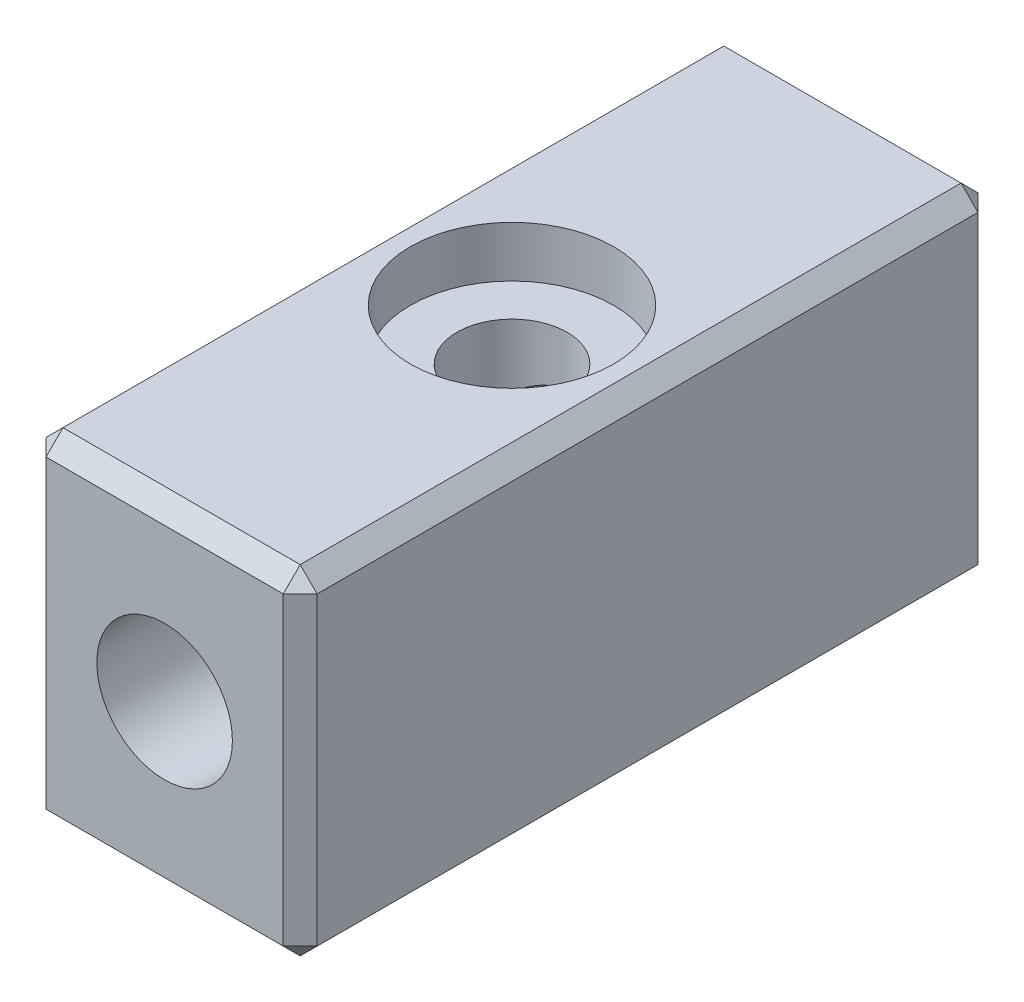
ISO-10303-21;
HEADER;
FILE_DESCRIPTION(('STEP AP214'),'2;1');
FILE_NAME('part.step','',(''),(''),'','','');
FILE_SCHEMA(('AUTOMOTIVE_DESIGN { 1 0 10303 214 1 1 1 1 }'));
ENDSEC;
DATA;
#1=APPLICATION_CONTEXT('core data for automotive mechanical design processes');
#2=APPLICATION_PROTOCOL_DEFINITION('international standard','automotive_design',2000,#1);
#3=PRODUCT_CONTEXT('',#1,'mechanical');
#4=PRODUCT('Part','Part','',(#3));
#5=PRODUCT_RELATED_PRODUCT_CATEGORY('part','',(#4));
#6=PRODUCT_DEFINITION_FORMATION('','',#4);
#7=PRODUCT_DEFINITION_CONTEXT('part definition',#1,'design');
#8=PRODUCT_DEFINITION('design','',#6,#7);
#9=PRODUCT_DEFINITION_SHAPE('','',#8);
#10=(LENGTH_UNIT() NAMED_UNIT(*) SI_UNIT(.MILLI.,.METRE.));
#11=(NAMED_UNIT(*) PLANE_ANGLE_UNIT() SI_UNIT($,.RADIAN.));
#12=(NAMED_UNIT(*) SI_UNIT($,.STERADIAN.) SOLID_ANGLE_UNIT());
#13=UNCERTAINTY_MEASURE_WITH_UNIT(LENGTH_MEASURE(1.E-05),#10,'distance_accuracy_value','');
#14=(GEOMETRIC_REPRESENTATION_CONTEXT(3) GLOBAL_UNCERTAINTY_ASSIGNED_CONTEXT((#13)) GLOBAL_UNIT_ASSIGNED_CONTEXT((#10,
#11,#12)) REPRESENTATION_CONTEXT('',''));
#15=CARTESIAN_POINT('',(0.,0.,0.));
#16=DIRECTION('',(0.,0.,1.));
#17=DIRECTION('',(1.,0.,0.));
#18=AXIS2_PLACEMENT_3D('',#15,#16,#17);
#19=CARTESIAN_POINT('',(0.,-7.,10.25));
#20=DIRECTION('',(0.,1.,0.));
#21=DIRECTION('',(0.,0.,1.));
#22=AXIS2_PLACEMENT_3D('',#19,#20,#21);
#23=CYLINDRICAL_SURFACE('',#22,1.625);
#24=CARTESIAN_POINT('',(0.,2.,11.875));
#25=CARTESIAN_POINT('',(-0.077687357955839,1.99999354879527,11.8749933728701));
#26=CARTESIAN_POINT('',(-0.155462967100208,1.9954284564811,11.8693836728164));
#27=CARTESIAN_POINT('',(-0.308487256323804,1.97757422208696,11.8473305319977));
#28=CARTESIAN_POINT('',(-0.383731179508215,1.96426952673167,11.8308677766017));
#29=CARTESIAN_POINT('',(-0.529074999974396,1.93018615668385,11.7883124160369));
#30=CARTESIAN_POINT('',(-0.599203974577691,1.90945447135066,11.7622803280343));
#31=CARTESIAN_POINT('',(-0.733522504384539,1.86199619588915,11.7018958027853));
#32=CARTESIAN_POINT('',(-0.797711368349583,1.83526890930099,11.667542398883));
#33=CARTESIAN_POINT('',(-0.941206531859363,1.76705472448252,11.57823941827));
#34=CARTESIAN_POINT('',(-1.0177698216182,1.72369928857352,11.5203101286191));
#35=CARTESIAN_POINT('',(-1.15841606691424,1.63252106893399,11.3935488484919));
#36=CARTESIAN_POINT('',(-1.22246224122534,1.58468571266492,11.3246857728611));
#37=CARTESIAN_POINT('',(-1.33872677424837,1.487823357685,11.1760175852269));
#38=CARTESIAN_POINT('',(-1.39072878178809,1.43878982761696,11.096048349981));
#39=CARTESIAN_POINT('',(-1.48083670468378,1.34583078460387,10.9259936395723));
#40=CARTESIAN_POINT('',(-1.51898725678864,1.30188918014082,10.8359419054729));
#41=CARTESIAN_POINT('',(-1.56620619398635,1.2440840418201,10.6867999699758));
#42=CARTESIAN_POINT('',(-1.58070420645942,1.22545550979627,10.6313054054931));
#43=CARTESIAN_POINT('',(-1.60390143116161,1.19493432086563,10.5173755541024));
#44=CARTESIAN_POINT('',(-1.61261510407165,1.18302487771775,10.45894799636));
#45=CARTESIAN_POINT('',(-1.62363276959609,1.16786855634705,10.3397153591291));
#46=CARTESIAN_POINT('',(-1.62587234290574,1.16470875271523,10.2788924483809));
#47=CARTESIAN_POINT('',(-1.62350766752796,1.16799987542873,10.1576287760698));
#48=CARTESIAN_POINT('',(-1.61889923037064,1.17445668361772,10.0971882711105));
#49=CARTESIAN_POINT('',(-1.6022761427835,1.19704696091321,9.97084588891335));
#50=CARTESIAN_POINT('',(-1.58936004790627,1.21435055427699,9.90528324485805));
#51=CARTESIAN_POINT('',(-1.55644163444395,1.25626308459862,9.77836394661769));
#52=CARTESIAN_POINT('',(-1.53641744395236,1.28089453135788,9.71702097997819));
#53=CARTESIAN_POINT('',(-1.47790201883828,1.34859403082441,9.56744588145881));
#54=CARTESIAN_POINT('',(-1.43524553441984,1.39452152288037,9.4821588315727));
#55=CARTESIAN_POINT('',(-1.33679489037521,1.4891899763325,9.3212882259169));
#56=CARTESIAN_POINT('',(-1.28097987831492,1.53793530967644,9.2457203690735));
#57=CARTESIAN_POINT('',(-1.15433872401482,1.63526989472892,9.1021333991519));
#58=CARTESIAN_POINT('',(-1.08305927003828,1.6837951535552,9.0344667952232));
#59=CARTESIAN_POINT('',(-0.927015757799725,1.7744700962118,8.91169323062353));
#60=CARTESIAN_POINT('',(-0.842286790015232,1.81663582895334,8.85655447011996));
#61=CARTESIAN_POINT('',(-0.685671013718499,1.88013018129862,8.77488262185814));
#62=CARTESIAN_POINT('',(-0.616738294216002,1.90399458902128,8.74465708978518));
#63=CARTESIAN_POINT('',(-0.473455645854618,1.94457361170736,8.69364776001418));
#64=CARTESIAN_POINT('',(-0.399109730639077,1.96129346211453,8.67285704790112));
#65=CARTESIAN_POINT('',(-0.246344739170605,1.98628664100974,8.64188178889347));
#66=CARTESIAN_POINT('',(-0.167903966792824,1.99450886882469,8.63176140101525));
#67=CARTESIAN_POINT('',(-0.00996672129135603,2.00153442722647,8.62310963033247));
#68=CARTESIAN_POINT('',(0.0695294082023801,2.00034075206231,8.62457456340624));
#69=CARTESIAN_POINT('',(0.219312970588321,1.98922346562989,8.63827805181183));
#70=CARTESIAN_POINT('',(0.289762052351858,1.9801334119513,8.64948798566098));
#71=CARTESIAN_POINT('',(0.427407686511049,1.95504988327428,8.68062754216478));
#72=CARTESIAN_POINT('',(0.494603559045785,1.93905497215433,8.70055897879158));
#73=CARTESIAN_POINT('',(0.627404269795816,1.9003601464828,8.74925923155521));
#74=CARTESIAN_POINT('',(0.692793217115817,1.87738529928881,8.77839285756732));
#75=CARTESIAN_POINT('',(0.817667719219735,1.82646509793591,8.84393312275018));
#76=CARTESIAN_POINT('',(0.877151786444768,1.79851849621727,8.88034158767549));
#77=CARTESIAN_POINT('',(1.01513524710928,1.72569252714969,8.97717697242691));
#78=CARTESIAN_POINT('',(1.09018367867275,1.67884365069025,9.04104900348188));
#79=CARTESIAN_POINT('',(1.22695555521745,1.58165720431014,9.18005516906171));
#80=CARTESIAN_POINT('',(1.28862015949084,1.53130546487771,9.25523666895536));
#81=CARTESIAN_POINT('',(1.37110195941884,1.45653421078326,9.37642546758947));
#82=CARTESIAN_POINT('',(1.39709959372071,1.43153212038635,9.41861101475694));
#83=CARTESIAN_POINT('',(1.44539231909061,1.38275992857254,9.5057177834228));
#84=CARTESIAN_POINT('',(1.46768551263704,1.35899046280348,9.55064039092076));
#85=CARTESIAN_POINT('',(1.52847949956992,1.2912633848622,9.6892130230092));
#86=CARTESIAN_POINT('',(1.56133620393295,1.25046214728857,9.78730441772));
#87=CARTESIAN_POINT('',(1.5968634847318,1.20434405557262,9.94399070919101));
#88=CARTESIAN_POINT('',(1.60644866246003,1.19140720613955,9.99877200022116));
#89=CARTESIAN_POINT('',(1.61994444914748,1.17299281931033,10.1102196235699));
#90=CARTESIAN_POINT('',(1.62386770772838,1.16749865547,10.1668814635633));
#91=CARTESIAN_POINT('',(1.62570963409608,1.16493507804418,10.2807054820751));
#92=CARTESIAN_POINT('',(1.62360681581816,1.16789581038235,10.3378687246475));
#93=CARTESIAN_POINT('',(1.61355345618824,1.18174104439322,10.4507372657298));
#94=CARTESIAN_POINT('',(1.60559226735473,1.19263997322404,10.5064397181272));
#95=CARTESIAN_POINT('',(1.58067789108497,1.22556487771296,10.6343148124194));
#96=CARTESIAN_POINT('',(1.56154555079501,1.25015755317511,10.7053805675171));
#97=CARTESIAN_POINT('',(1.51506288734557,1.30610544821361,10.8419878922432));
#98=CARTESIAN_POINT('',(1.48768553768955,1.33748281058379,10.9075103725864));
#99=CARTESIAN_POINT('',(1.41138626498154,1.41856466764915,11.0618134619428));
#100=CARTESIAN_POINT('',(1.35833177750582,1.47010478743265,11.147585713693));
#101=CARTESIAN_POINT('',(1.23751391200667,1.57318046622137,11.3079411129351));
#102=CARTESIAN_POINT('',(1.16975523582132,1.62471602142843,11.3825278242729));
#103=CARTESIAN_POINT('',(1.03231155414268,1.71461419442066,11.5078065282038));
#104=CARTESIAN_POINT('',(0.96487051375943,1.75373399309412,11.5604073167188));
#105=CARTESIAN_POINT('',(0.82024249010633,1.82584302570047,11.6554482830428));
#106=CARTESIAN_POINT('',(0.743069863040515,1.85884111680731,11.6979031664821));
#107=CARTESIAN_POINT('',(0.594860695751205,1.91079837319564,11.7639712673024));
#108=CARTESIAN_POINT('',(0.525238639571074,1.93121723151876,11.7896034609691));
#109=CARTESIAN_POINT('',(0.381555524372051,1.96464268363454,11.8313298075183));
#110=CARTESIAN_POINT('',(0.307504404800825,1.97766523340066,11.8474444954294));
#111=CARTESIAN_POINT('',(0.193986200590974,1.9909456812899,11.8638458679102));
#112=CARTESIAN_POINT('',(0.155396271357845,1.99433153032105,11.8680191571931));
#113=CARTESIAN_POINT('',(0.0778783362899849,1.99886054593715,11.8735981795442));
#114=CARTESIAN_POINT('',(0.0389502601635923,2.00000323445293,11.8750033226569));
#115=CARTESIAN_POINT('',(0.,2.,11.875));
#116=B_SPLINE_CURVE_WITH_KNOTS('',3,(#24,#25,#26,#27,#28,#29,#30,#31,#32,#33,#34,#35,#36,#37,
#38,#39,#40,#41,#42,#43,#44,#45,#46,#47,#48,#49,#50,#51,#52,#53,#54,#55,#56,#57,#58,#59,#60,#61,
#62,#63,#64,#65,#66,#67,#68,#69,#70,#71,#72,#73,#74,#75,#76,#77,#78,#79,#80,#81,#82,#83,#84,#85,
#86,#87,#88,#89,#90,#91,#92,#93,#94,#95,#96,#97,#98,#99,#100,#101,#102,#103,#104,#105,#106,#107,
#108,#109,#110,#111,#112,#113,#114,#115),.UNSPECIFIED.,.T.,.F.,(4,2,2,2,2,2,2,2,2,2,2,2,2,2,2,2,
2,2,2,2,2,2,2,2,2,2,2,2,2,2,2,2,2,2,2,2,2,2,2,2,2,2,2,2,2,4),(0.,0.232893690201569,
0.466202972393725,0.698061484041515,0.929946942750643,1.24430606287864,1.55957547108331,
1.88013164979569,2.19964546009525,2.38000999643275,2.55992191129705,2.74161794545689,
2.92342515667749,3.12935204702559,3.33591815537832,3.65177497720494,3.96813574520239,
4.29546377541527,4.62195141743018,4.85790440701917,5.09368419540844,5.33087374414643,
5.56798786985422,5.78274981565106,5.99755645070724,6.22225846581893,6.44701694502352,
6.77267104435955,7.09972908365389,7.26604462385623,7.43244509481405,7.76262481512771,
7.93328728313584,8.10356787079954,8.27445635096059,8.44565618732137,8.6771382083016,
8.90938742432821,9.24747595283561,9.58545653242122,9.86654805507715,10.1472296542537,
10.3771482894416,10.6065690211765,10.7233105012267,10.8400768588748),.UNSPECIFIED.);
#117=CARTESIAN_POINT('',(0.,2.,11.875));
#118=VERTEX_POINT('',#117);
#119=EDGE_CURVE('E276',#118,#118,#116,.T.);
#120=ORIENTED_EDGE('',*,*,#119,.T.);
#121=EDGE_LOOP('',(#120));
#122=FACE_BOUND('',#121,.T.);
#123=CARTESIAN_POINT('',(0.,3.5,10.25));
#124=DIRECTION('',(0.,1.,0.));
#125=DIRECTION('',(0.,0.,1.));
#126=AXIS2_PLACEMENT_3D('',#123,#124,#125);
#127=CIRCLE('',#126,1.625);
#128=CARTESIAN_POINT('',(0.,3.5,11.875));
#129=VERTEX_POINT('',#128);
#130=EDGE_CURVE('E57',#129,#129,#127,.F.);
#131=ORIENTED_EDGE('',*,*,#130,.F.);
#132=EDGE_LOOP('',(#131));
#133=FACE_BOUND('',#132,.T.);
#134=ADVANCED_FACE('F53',(#122,#133),#23,.F.);
#135=CARTESIAN_POINT('',(4.,0.,20.5));
#136=DIRECTION('',(1.,0.,0.));
#137=DIRECTION('',(0.,1.,0.));
#138=AXIS2_PLACEMENT_3D('',#135,#136,#137);
#139=PLANE('',#138);
#140=DIRECTION('',(0.,-1.,0.));
#141=VECTOR('',#140,1.);
#142=CARTESIAN_POINT('',(4.,0.,20.));
#143=LINE('',#142,#141);
#144=CARTESIAN_POINT('',(4.,4.49999999999999,20.));
#145=VERTEX_POINT('',#144);
#146=CARTESIAN_POINT('',(4.,-4.5,20.));
#147=VERTEX_POINT('',#146);
#148=EDGE_CURVE('E62',#145,#147,#143,.T.);
#149=ORIENTED_EDGE('',*,*,#148,.T.);
#150=DIRECTION('',(0.,0.,-1.));
#151=VECTOR('',#150,1.);
#152=CARTESIAN_POINT('',(4.,-4.5,0.));
#153=LINE('',#152,#151);
#154=CARTESIAN_POINT('',(4.,-4.5,0.500000000000007));
#155=VERTEX_POINT('',#154);
#156=EDGE_CURVE('E12',#147,#155,#153,.T.);
#157=ORIENTED_EDGE('',*,*,#156,.T.);
#158=DIRECTION('',(0.,1.,0.));
#159=VECTOR('',#158,1.);
#160=CARTESIAN_POINT('',(4.,5.,0.500000000000007));
#161=LINE('',#160,#159);
#162=CARTESIAN_POINT('',(4.,4.49999999999999,0.500000000000007));
#163=VERTEX_POINT('',#162);
#164=EDGE_CURVE('E76',#155,#163,#161,.T.);
#165=ORIENTED_EDGE('',*,*,#164,.T.);
#166=DIRECTION('',(0.,0.,1.));
#167=VECTOR('',#166,1.);
#168=CARTESIAN_POINT('',(4.,4.49999999999999,20.5));
#169=LINE('',#168,#167);
#170=EDGE_CURVE('E218',#163,#145,#169,.T.);
#171=ORIENTED_EDGE('',*,*,#170,.T.);
#172=EDGE_LOOP('',(#149,#157,#165,#171));
#173=FACE_BOUND('',#172,.T.);
#174=ADVANCED_FACE('F305',(#173),#139,.T.);
#175=CARTESIAN_POINT('',(0.,5.,20.5));
#176=DIRECTION('',(0.,1.,0.));
#177=DIRECTION('',(0.,0.,1.));
#178=AXIS2_PLACEMENT_3D('',#175,#176,#177);
#179=PLANE('',#178);
#180=CARTESIAN_POINT('',(0.,5.,10.25));
#181=DIRECTION('',(0.,1.,0.));
#182=DIRECTION('',(0.,0.,1.));
#183=AXIS2_PLACEMENT_3D('',#180,#181,#182);
#184=CIRCLE('',#183,3.);
#185=CARTESIAN_POINT('',(0.,5.,13.25));
#186=VERTEX_POINT('',#185);
#187=EDGE_CURVE('E326',#186,#186,#184,.T.);
#188=ORIENTED_EDGE('',*,*,#187,.F.);
#189=EDGE_LOOP('',(#188));
#190=FACE_BOUND('',#189,.T.);
#191=DIRECTION('',(-1.,0.,0.));
#192=VECTOR('',#191,1.);
#193=CARTESIAN_POINT('',(-4.,5.,0.5));
#194=LINE('',#193,#192);
#195=CARTESIAN_POINT('',(3.5,5.,0.5));
#196=VERTEX_POINT('',#195);
#197=CARTESIAN_POINT('',(-3.5,5.,0.5));
#198=VERTEX_POINT('',#197);
#199=EDGE_CURVE('E188',#196,#198,#194,.T.);
#200=ORIENTED_EDGE('',*,*,#199,.T.);
#201=DIRECTION('',(0.,0.,1.));
#202=VECTOR('',#201,1.);
#203=CARTESIAN_POINT('',(-3.5,5.,20.5));
#204=LINE('',#203,#202);
#205=CARTESIAN_POINT('',(-3.5,5.,20.));
#206=VERTEX_POINT('',#205);
#207=EDGE_CURVE('E151',#198,#206,#204,.T.);
#208=ORIENTED_EDGE('',*,*,#207,.T.);
#209=DIRECTION('',(1.,0.,0.));
#210=VECTOR('',#209,1.);
#211=CARTESIAN_POINT('',(0.,5.,20.));
#212=LINE('',#211,#210);
#213=CARTESIAN_POINT('',(3.5,5.,20.));
#214=VERTEX_POINT('',#213);
#215=EDGE_CURVE('E180',#206,#214,#212,.T.);
#216=ORIENTED_EDGE('',*,*,#215,.T.);
#217=DIRECTION('',(0.,0.,-1.));
#218=VECTOR('',#217,1.);
#219=CARTESIAN_POINT('',(3.5,5.,20.5));
#220=LINE('',#219,#218);
#221=EDGE_CURVE('E182',#214,#196,#220,.T.);
#222=ORIENTED_EDGE('',*,*,#221,.T.);
#223=EDGE_LOOP('',(#200,#208,#216,#222));
#224=FACE_BOUND('',#223,.T.);
#225=ADVANCED_FACE('F366',(#190,#224),#179,.T.);
#226=CARTESIAN_POINT('',(-4.,0.,20.5));
#227=DIRECTION('',(1.,0.,0.));
#228=DIRECTION('',(0.,0.,-1.));
#229=AXIS2_PLACEMENT_3D('',#226,#227,#228);
#230=PLANE('',#229);
#231=DIRECTION('',(0.,1.,0.));
#232=VECTOR('',#231,1.);
#233=CARTESIAN_POINT('',(-4.,5.,20.));
#234=LINE('',#233,#232);
#235=CARTESIAN_POINT('',(-4.,-4.49999999999999,20.));
#236=VERTEX_POINT('',#235);
#237=CARTESIAN_POINT('',(-4.,4.49999999999999,20.));
#238=VERTEX_POINT('',#237);
#239=EDGE_CURVE('E178',#236,#238,#234,.T.);
#240=ORIENTED_EDGE('',*,*,#239,.T.);
#241=DIRECTION('',(0.,0.,-1.));
#242=VECTOR('',#241,1.);
#243=CARTESIAN_POINT('',(-4.,4.49999999999999,0.));
#244=LINE('',#243,#242);
#245=CARTESIAN_POINT('',(-4.,4.49999999999999,0.5));
#246=VERTEX_POINT('',#245);
#247=EDGE_CURVE('E149',#238,#246,#244,.T.);
#248=ORIENTED_EDGE('',*,*,#247,.T.);
#249=DIRECTION('',(0.,-1.,0.));
#250=VECTOR('',#249,1.);
#251=CARTESIAN_POINT('',(-4.,0.,0.5));
#252=LINE('',#251,#250);
#253=CARTESIAN_POINT('',(-4.,-4.49999999999999,0.5));
#254=VERTEX_POINT('',#253);
#255=EDGE_CURVE('E167',#246,#254,#252,.T.);
#256=ORIENTED_EDGE('',*,*,#255,.T.);
#257=DIRECTION('',(0.,0.,1.));
#258=VECTOR('',#257,1.);
#259=CARTESIAN_POINT('',(-4.,-4.49999999999999,20.5));
#260=LINE('',#259,#258);
#261=EDGE_CURVE('E173',#254,#236,#260,.T.);
#262=ORIENTED_EDGE('',*,*,#261,.T.);
#263=EDGE_LOOP('',(#240,#248,#256,#262));
#264=FACE_BOUND('',#263,.T.);
#265=ADVANCED_FACE('F176',(#264),#230,.F.);
#266=CARTESIAN_POINT('',(0.,-5.,20.5));
#267=DIRECTION('',(0.,1.,0.));
#268=DIRECTION('',(0.,0.,1.));
#269=AXIS2_PLACEMENT_3D('',#266,#267,#268);
#270=PLANE('',#269);
#271=DIRECTION('',(0.,0.,1.));
#272=VECTOR('',#271,1.);
#273=CARTESIAN_POINT('',(3.49999999999999,-5.,20.5));
#274=LINE('',#273,#272);
#275=CARTESIAN_POINT('',(3.49999999999999,-5.,0.5));
#276=VERTEX_POINT('',#275);
#277=CARTESIAN_POINT('',(3.49999999999999,-5.,20.));
#278=VERTEX_POINT('',#277);
#279=EDGE_CURVE('E202',#276,#278,#274,.T.);
#280=ORIENTED_EDGE('',*,*,#279,.T.);
#281=DIRECTION('',(-1.,0.,0.));
#282=VECTOR('',#281,1.);
#283=CARTESIAN_POINT('',(-4.,-5.,20.));
#284=LINE('',#283,#282);
#285=CARTESIAN_POINT('',(-3.5,-5.,20.));
#286=VERTEX_POINT('',#285);
#287=EDGE_CURVE('E207',#278,#286,#284,.T.);
#288=ORIENTED_EDGE('',*,*,#287,.T.);
#289=DIRECTION('',(0.,0.,-1.));
#290=VECTOR('',#289,1.);
#291=CARTESIAN_POINT('',(-3.5,-5.,20.5));
#292=LINE('',#291,#290);
#293=CARTESIAN_POINT('',(-3.5,-5.,0.5));
#294=VERTEX_POINT('',#293);
#295=EDGE_CURVE('E204',#286,#294,#292,.T.);
#296=ORIENTED_EDGE('',*,*,#295,.T.);
#297=DIRECTION('',(1.,0.,0.));
#298=VECTOR('',#297,1.);
#299=CARTESIAN_POINT('',(0.,-5.,0.5));
#300=LINE('',#299,#298);
#301=EDGE_CURVE('E200',#294,#276,#300,.T.);
#302=ORIENTED_EDGE('',*,*,#301,.T.);
#303=EDGE_LOOP('',(#280,#288,#296,#302));
#304=FACE_BOUND('',#303,.T.);
#305=CARTESIAN_POINT('',(0.,-5.,10.25));
#306=DIRECTION('',(0.,1.,0.));
#307=DIRECTION('',(0.,0.,1.));
#308=AXIS2_PLACEMENT_3D('',#305,#306,#307);
#309=CIRCLE('',#308,1.625);
#310=CARTESIAN_POINT('',(0.,-5.,11.875));
#311=VERTEX_POINT('',#310);
#312=EDGE_CURVE('E287',#311,#311,#309,.T.);
#313=ORIENTED_EDGE('',*,*,#312,.T.);
#314=EDGE_LOOP('',(#313));
#315=FACE_BOUND('',#314,.T.);
#316=ADVANCED_FACE('F357',(#304,#315),#270,.F.);
#317=CARTESIAN_POINT('',(0.,0.,20.5));
#318=DIRECTION('',(0.,0.,1.));
#319=DIRECTION('',(1.,0.,0.));
#320=AXIS2_PLACEMENT_3D('',#317,#318,#319);
#321=PLANE('',#320);
#322=DIRECTION('',(-1.,0.,0.));
#323=VECTOR('',#322,1.);
#324=CARTESIAN_POINT('',(0.,4.49999999999999,20.5));
#325=LINE('',#324,#323);
#326=CARTESIAN_POINT('',(3.49999999999999,4.49999999999999,20.5));
#327=VERTEX_POINT('',#326);
#328=CARTESIAN_POINT('',(-3.49999999999999,4.49999999999999,20.5));
#329=VERTEX_POINT('',#328);
#330=EDGE_CURVE('E191',#327,#329,#325,.T.);
#331=ORIENTED_EDGE('',*,*,#330,.T.);
#332=DIRECTION('',(0.,-1.,0.));
#333=VECTOR('',#332,1.);
#334=CARTESIAN_POINT('',(-3.49999999999999,-5.,20.5));
#335=LINE('',#334,#333);
#336=CARTESIAN_POINT('',(-3.49999999999999,-4.49999999999999,20.5));
#337=VERTEX_POINT('',#336);
#338=EDGE_CURVE('E197',#329,#337,#335,.T.);
#339=ORIENTED_EDGE('',*,*,#338,.T.);
#340=DIRECTION('',(1.,0.,0.));
#341=VECTOR('',#340,1.);
#342=CARTESIAN_POINT('',(4.,-4.49999999999999,20.5));
#343=LINE('',#342,#341);
#344=CARTESIAN_POINT('',(3.49999999999999,-4.49999999999999,20.5));
#345=VERTEX_POINT('',#344);
#346=EDGE_CURVE('E195',#337,#345,#343,.T.);
#347=ORIENTED_EDGE('',*,*,#346,.T.);
#348=DIRECTION('',(0.,1.,0.));
#349=VECTOR('',#348,1.);
#350=CARTESIAN_POINT('',(3.49999999999999,0.,20.5));
#351=LINE('',#350,#349);
#352=EDGE_CURVE('E193',#345,#327,#351,.T.);
#353=ORIENTED_EDGE('',*,*,#352,.T.);
#354=EDGE_LOOP('',(#331,#339,#347,#353));
#355=FACE_BOUND('',#354,.T.);
#356=CARTESIAN_POINT('',(0.,0.,20.5));
#357=DIRECTION('',(0.,0.,1.));
#358=DIRECTION('',(1.,0.,0.));
#359=AXIS2_PLACEMENT_3D('',#356,#357,#358);
#360=CIRCLE('',#359,2.);
#361=CARTESIAN_POINT('',(2.,0.,20.5));
#362=VERTEX_POINT('',#361);
#363=EDGE_CURVE('E174',#362,#362,#360,.F.);
#364=ORIENTED_EDGE('',*,*,#363,.T.);
#365=EDGE_LOOP('',(#364));
#366=FACE_BOUND('',#365,.T.);
#367=ADVANCED_FACE('F339',(#355,#366),#321,.T.);
#368=CARTESIAN_POINT('',(0.,0.,0.));
#369=DIRECTION('',(0.,0.,1.));
#370=DIRECTION('',(1.,0.,0.));
#371=AXIS2_PLACEMENT_3D('',#368,#369,#370);
#372=PLANE('',#371);
#373=DIRECTION('',(-1.,0.,0.));
#374=VECTOR('',#373,1.);
#375=CARTESIAN_POINT('',(0.,-4.49999999999999,0.));
#376=LINE('',#375,#374);
#377=CARTESIAN_POINT('',(3.5,-4.49999999999999,0.));
#378=VERTEX_POINT('',#377);
#379=CARTESIAN_POINT('',(-3.49999999999999,-4.49999999999999,0.));
#380=VERTEX_POINT('',#379);
#381=EDGE_CURVE('E213',#378,#380,#376,.T.);
#382=ORIENTED_EDGE('',*,*,#381,.T.);
#383=DIRECTION('',(0.,1.,0.));
#384=VECTOR('',#383,1.);
#385=CARTESIAN_POINT('',(-3.49999999999999,0.,0.));
#386=LINE('',#385,#384);
#387=CARTESIAN_POINT('',(-3.49999999999999,4.49999999999999,0.));
#388=VERTEX_POINT('',#387);
#389=EDGE_CURVE('E215',#380,#388,#386,.T.);
#390=ORIENTED_EDGE('',*,*,#389,.T.);
#391=DIRECTION('',(1.,0.,0.));
#392=VECTOR('',#391,1.);
#393=CARTESIAN_POINT('',(4.,4.49999999999999,0.));
#394=LINE('',#393,#392);
#395=CARTESIAN_POINT('',(3.5,4.49999999999999,0.));
#396=VERTEX_POINT('',#395);
#397=EDGE_CURVE('E209',#388,#396,#394,.T.);
#398=ORIENTED_EDGE('',*,*,#397,.T.);
#399=DIRECTION('',(0.,-1.,0.));
#400=VECTOR('',#399,1.);
#401=CARTESIAN_POINT('',(3.5,-5.,0.));
#402=LINE('',#401,#400);
#403=EDGE_CURVE('E211',#396,#378,#402,.T.);
#404=ORIENTED_EDGE('',*,*,#403,.T.);
#405=EDGE_LOOP('',(#382,#390,#398,#404));
#406=FACE_BOUND('',#405,.T.);
#407=CARTESIAN_POINT('',(0.,0.,0.));
#408=DIRECTION('',(0.,0.,1.));
#409=DIRECTION('',(1.,0.,0.));
#410=AXIS2_PLACEMENT_3D('',#407,#408,#409);
#411=CIRCLE('',#410,2.);
#412=CARTESIAN_POINT('',(2.,0.,0.));
#413=VERTEX_POINT('',#412);
#414=EDGE_CURVE('E332',#413,#413,#411,.T.);
#415=ORIENTED_EDGE('',*,*,#414,.T.);
#416=EDGE_LOOP('',(#415));
#417=FACE_BOUND('',#416,.T.);
#418=ADVANCED_FACE('F343',(#406,#417),#372,.F.);
#419=CARTESIAN_POINT('',(0.,0.,23.));
#420=DIRECTION('',(0.,0.,-1.));
#421=DIRECTION('',(-1.,0.,0.));
#422=AXIS2_PLACEMENT_3D('',#419,#420,#421);
#423=CYLINDRICAL_SURFACE('',#422,2.);
#424=CARTESIAN_POINT('',(0.,-2.,11.875));
#425=CARTESIAN_POINT('',(0.077687357955839,-1.99999354879527,11.8749933728701));
#426=CARTESIAN_POINT('',(0.155462967100208,-1.9954284564811,11.8693836728164));
#427=CARTESIAN_POINT('',(0.308487256323804,-1.97757422208696,11.8473305319977));
#428=CARTESIAN_POINT('',(0.383731179508215,-1.96426952673167,11.8308677766017));
#429=CARTESIAN_POINT('',(0.529074999974396,-1.93018615668385,11.7883124160369));
#430=CARTESIAN_POINT('',(0.599203974577691,-1.90945447135066,11.7622803280343));
#431=CARTESIAN_POINT('',(0.733522504384539,-1.86199619588915,11.7018958027853));
#432=CARTESIAN_POINT('',(0.797711368349583,-1.83526890930099,11.667542398883));
#433=CARTESIAN_POINT('',(0.941206531859363,-1.76705472448252,11.57823941827));
#434=CARTESIAN_POINT('',(1.0177698216182,-1.72369928857352,11.5203101286191));
#435=CARTESIAN_POINT('',(1.15841606691424,-1.63252106893399,11.3935488484919));
#436=CARTESIAN_POINT('',(1.22246224122534,-1.58468571266492,11.3246857728611));
#437=CARTESIAN_POINT('',(1.33872677424837,-1.487823357685,11.1760175852269));
#438=CARTESIAN_POINT('',(1.39072878178809,-1.43878982761696,11.096048349981));
#439=CARTESIAN_POINT('',(1.48083670468378,-1.34583078460387,10.9259936395723));
#440=CARTESIAN_POINT('',(1.51898725678864,-1.30188918014082,10.8359419054729));
#441=CARTESIAN_POINT('',(1.56620619398635,-1.2440840418201,10.6867999699758));
#442=CARTESIAN_POINT('',(1.58070420645942,-1.22545550979627,10.6313054054931));
#443=CARTESIAN_POINT('',(1.60390143116161,-1.19493432086563,10.5173755541024));
#444=CARTESIAN_POINT('',(1.61261510407165,-1.18302487771775,10.45894799636));
#445=CARTESIAN_POINT('',(1.62363276959609,-1.16786855634705,10.3397153591291));
#446=CARTESIAN_POINT('',(1.62587234290574,-1.16470875271523,10.2788924483809));
#447=CARTESIAN_POINT('',(1.62350766752796,-1.16799987542873,10.1576287760698));
#448=CARTESIAN_POINT('',(1.61889923037064,-1.17445668361772,10.0971882711105));
#449=CARTESIAN_POINT('',(1.6022761427835,-1.19704696091321,9.97084588891335));
#450=CARTESIAN_POINT('',(1.58936004790627,-1.21435055427699,9.90528324485805));
#451=CARTESIAN_POINT('',(1.55644163444395,-1.25626308459862,9.77836394661769));
#452=CARTESIAN_POINT('',(1.53641744395236,-1.28089453135788,9.71702097997819));
#453=CARTESIAN_POINT('',(1.47790201883828,-1.34859403082441,9.56744588145881));
#454=CARTESIAN_POINT('',(1.43524553441984,-1.39452152288037,9.4821588315727));
#455=CARTESIAN_POINT('',(1.33679489037521,-1.4891899763325,9.3212882259169));
#456=CARTESIAN_POINT('',(1.28097987831492,-1.53793530967644,9.2457203690735));
#457=CARTESIAN_POINT('',(1.15433872401482,-1.63526989472892,9.1021333991519));
#458=CARTESIAN_POINT('',(1.08305927003828,-1.6837951535552,9.0344667952232));
#459=CARTESIAN_POINT('',(0.927015757799725,-1.7744700962118,8.91169323062353));
#460=CARTESIAN_POINT('',(0.842286790015232,-1.81663582895334,8.85655447011996));
#461=CARTESIAN_POINT('',(0.685671013718499,-1.88013018129862,8.77488262185814));
#462=CARTESIAN_POINT('',(0.616738294216002,-1.90399458902128,8.74465708978518));
#463=CARTESIAN_POINT('',(0.473455645854618,-1.94457361170736,8.69364776001418));
#464=CARTESIAN_POINT('',(0.399109730639077,-1.96129346211453,8.67285704790112));
#465=CARTESIAN_POINT('',(0.246344739170605,-1.98628664100974,8.64188178889347));
#466=CARTESIAN_POINT('',(0.167903966792824,-1.99450886882469,8.63176140101525));
#467=CARTESIAN_POINT('',(0.00996672129135603,-2.00153442722647,8.62310963033247));
#468=CARTESIAN_POINT('',(-0.0695294082023801,-2.00034075206231,8.62457456340624));
#469=CARTESIAN_POINT('',(-0.219312970588321,-1.98922346562989,8.63827805181183));
#470=CARTESIAN_POINT('',(-0.289762052351858,-1.9801334119513,8.64948798566098));
#471=CARTESIAN_POINT('',(-0.427407686511049,-1.95504988327428,8.68062754216478));
#472=CARTESIAN_POINT('',(-0.494603559045785,-1.93905497215433,8.70055897879158));
#473=CARTESIAN_POINT('',(-0.627404269795816,-1.9003601464828,8.74925923155521));
#474=CARTESIAN_POINT('',(-0.692793217115817,-1.87738529928881,8.77839285756732));
#475=CARTESIAN_POINT('',(-0.817667719219735,-1.82646509793591,8.84393312275018));
#476=CARTESIAN_POINT('',(-0.877151786444768,-1.79851849621727,8.88034158767549));
#477=CARTESIAN_POINT('',(-1.01513524710928,-1.72569252714969,8.97717697242691));
#478=CARTESIAN_POINT('',(-1.09018367867275,-1.67884365069025,9.04104900348188));
#479=CARTESIAN_POINT('',(-1.22695555521745,-1.58165720431014,9.18005516906171));
#480=CARTESIAN_POINT('',(-1.28862015949084,-1.53130546487771,9.25523666895536));
#481=CARTESIAN_POINT('',(-1.37110195941884,-1.45653421078326,9.37642546758947));
#482=CARTESIAN_POINT('',(-1.39709959372071,-1.43153212038635,9.41861101475694));
#483=CARTESIAN_POINT('',(-1.44539231909061,-1.38275992857254,9.5057177834228));
#484=CARTESIAN_POINT('',(-1.46768551263704,-1.35899046280348,9.55064039092076));
#485=CARTESIAN_POINT('',(-1.52847949956992,-1.2912633848622,9.6892130230092));
#486=CARTESIAN_POINT('',(-1.56133620393295,-1.25046214728857,9.78730441772));
#487=CARTESIAN_POINT('',(-1.5968634847318,-1.20434405557262,9.94399070919101));
#488=CARTESIAN_POINT('',(-1.60644866246003,-1.19140720613955,9.99877200022116));
#489=CARTESIAN_POINT('',(-1.61994444914748,-1.17299281931033,10.1102196235699));
#490=CARTESIAN_POINT('',(-1.62386770772838,-1.16749865547,10.1668814635633));
#491=CARTESIAN_POINT('',(-1.62570963409608,-1.16493507804418,10.2807054820751));
#492=CARTESIAN_POINT('',(-1.62360681581816,-1.16789581038235,10.3378687246475));
#493=CARTESIAN_POINT('',(-1.61355345618824,-1.18174104439322,10.4507372657298));
#494=CARTESIAN_POINT('',(-1.60559226735473,-1.19263997322404,10.5064397181272));
#495=CARTESIAN_POINT('',(-1.58067789108497,-1.22556487771296,10.6343148124194));
#496=CARTESIAN_POINT('',(-1.56154555079501,-1.25015755317511,10.7053805675171));
#497=CARTESIAN_POINT('',(-1.51506288734557,-1.30610544821361,10.8419878922432));
#498=CARTESIAN_POINT('',(-1.48768553768955,-1.33748281058379,10.9075103725864));
#499=CARTESIAN_POINT('',(-1.41138626498154,-1.41856466764915,11.0618134619428));
#500=CARTESIAN_POINT('',(-1.35833177750582,-1.47010478743265,11.147585713693));
#501=CARTESIAN_POINT('',(-1.23751391200667,-1.57318046622137,11.3079411129351));
#502=CARTESIAN_POINT('',(-1.16975523582132,-1.62471602142843,11.3825278242729));
#503=CARTESIAN_POINT('',(-1.03231155414268,-1.71461419442066,11.5078065282038));
#504=CARTESIAN_POINT('',(-0.96487051375943,-1.75373399309412,11.5604073167188));
#505=CARTESIAN_POINT('',(-0.82024249010633,-1.82584302570047,11.6554482830428));
#506=CARTESIAN_POINT('',(-0.743069863040515,-1.85884111680731,11.6979031664821));
#507=CARTESIAN_POINT('',(-0.594860695751205,-1.91079837319564,11.7639712673024));
#508=CARTESIAN_POINT('',(-0.525238639571074,-1.93121723151876,11.7896034609691));
#509=CARTESIAN_POINT('',(-0.381555524372051,-1.96464268363454,11.8313298075183));
#510=CARTESIAN_POINT('',(-0.307504404800825,-1.97766523340066,11.8474444954294));
#511=CARTESIAN_POINT('',(-0.193986200590974,-1.9909456812899,11.8638458679102));
#512=CARTESIAN_POINT('',(-0.155396271357845,-1.99433153032105,11.8680191571931));
#513=CARTESIAN_POINT('',(-0.0778783362899849,-1.99886054593715,11.8735981795442));
#514=CARTESIAN_POINT('',(-0.0389502601635923,-2.00000323445293,11.8750033226569));
#515=CARTESIAN_POINT('',(0.,-2.,11.875));
#516=B_SPLINE_CURVE_WITH_KNOTS('',3,(#424,#425,#426,#427,#428,#429,#430,#431,#432,#433,#434,
#435,#436,#437,#438,#439,#440,#441,#442,#443,#444,#445,#446,#447,#448,#449,#450,#451,#452,#453,
#454,#455,#456,#457,#458,#459,#460,#461,#462,#463,#464,#465,#466,#467,#468,#469,#470,#471,#472,
#473,#474,#475,#476,#477,#478,#479,#480,#481,#482,#483,#484,#485,#486,#487,#488,#489,#490,#491,
#492,#493,#494,#495,#496,#497,#498,#499,#500,#501,#502,#503,#504,#505,#506,#507,#508,#509,#510,
#511,#512,#513,#514,#515),.UNSPECIFIED.,.T.,.F.,(4,2,2,2,2,2,2,2,2,2,2,2,2,2,2,2,2,2,2,2,2,2,2,
2,2,2,2,2,2,2,2,2,2,2,2,2,2,2,2,2,2,2,2,2,2,4),(0.,0.232893690201569,0.466202972393725,
0.698061484041515,0.929946942750643,1.24430606287864,1.55957547108331,1.88013164979569,
2.19964546009525,2.38000999643275,2.55992191129705,2.74161794545689,2.92342515667749,
3.12935204702559,3.33591815537832,3.65177497720494,3.96813574520239,4.29546377541527,
4.62195141743018,4.85790440701917,5.09368419540844,5.33087374414643,5.56798786985422,
5.78274981565106,5.99755645070724,6.22225846581893,6.44701694502352,6.77267104435955,
7.09972908365389,7.26604462385623,7.43244509481405,7.76262481512771,7.93328728313584,
8.10356787079954,8.27445635096059,8.44565618732137,8.6771382083016,8.90938742432821,
9.24747595283561,9.58545653242122,9.86654805507715,10.1472296542537,10.3771482894416,
10.6065690211765,10.7233105012267,10.8400768588748),.UNSPECIFIED.);
#517=CARTESIAN_POINT('',(0.,-2.,11.875));
#518=VERTEX_POINT('',#517);
#519=EDGE_CURVE('E282',#518,#518,#516,.T.);
#520=ORIENTED_EDGE('',*,*,#519,.F.);
#521=EDGE_LOOP('',(#520));
#522=FACE_BOUND('',#521,.T.);
#523=ORIENTED_EDGE('',*,*,#119,.F.);
#524=EDGE_LOOP('',(#523));
#525=FACE_BOUND('',#524,.T.);
#526=ORIENTED_EDGE('',*,*,#363,.F.);
#527=EDGE_LOOP('',(#526));
#528=FACE_BOUND('',#527,.T.);
#529=ORIENTED_EDGE('',*,*,#414,.F.);
#530=EDGE_LOOP('',(#529));
#531=FACE_BOUND('',#530,.T.);
#532=ADVANCED_FACE('F299',(#522,#525,#528,#531),#423,.F.);
#533=ORIENTED_EDGE('',*,*,#519,.T.);
#534=EDGE_LOOP('',(#533));
#535=FACE_BOUND('',#534,.T.);
#536=ORIENTED_EDGE('',*,*,#312,.F.);
#537=EDGE_LOOP('',(#536));
#538=FACE_BOUND('',#537,.T.);
#539=ADVANCED_FACE('F306',(#535,#538),#23,.F.);
#540=CARTESIAN_POINT('',(4.,-4.5,20.5));
#541=DIRECTION('',(0.707106781186542,-0.707106781186552,0.));
#542=DIRECTION('',(0.,0.,1.));
#543=AXIS2_PLACEMENT_3D('',#540,#541,#542);
#544=PLANE('',#543);
#545=DIRECTION('',(0.707106781186552,0.707106781186543,0.));
#546=VECTOR('',#545,1.);
#547=CARTESIAN_POINT('',(3.49999999999999,-5.,20.));
#548=LINE('',#547,#546);
#549=EDGE_CURVE('E274',#278,#147,#548,.T.);
#550=ORIENTED_EDGE('',*,*,#549,.F.);
#551=ORIENTED_EDGE('',*,*,#279,.F.);
#552=DIRECTION('',(-0.707106781186552,-0.707106781186543,0.));
#553=VECTOR('',#552,1.);
#554=CARTESIAN_POINT('',(4.,-4.5,0.500000000000007));
#555=LINE('',#554,#553);
#556=EDGE_CURVE('E272',#155,#276,#555,.T.);
#557=ORIENTED_EDGE('',*,*,#556,.F.);
#558=ORIENTED_EDGE('',*,*,#156,.F.);
#559=EDGE_LOOP('',(#550,#551,#557,#558));
#560=FACE_BOUND('',#559,.T.);
#561=ADVANCED_FACE('F55',(#560),#544,.T.);
#562=CARTESIAN_POINT('',(3.49999999999999,-5.,20.));
#563=DIRECTION('',(0.577350269189618,-0.577350269189626,0.577350269189634));
#564=DIRECTION('',(0.,-0.707106781186552,-0.707106781186543));
#565=AXIS2_PLACEMENT_3D('',#562,#563,#564);
#566=PLANE('',#565);
#567=DIRECTION('',(0.,-0.707106781186552,-0.707106781186543));
#568=VECTOR('',#567,1.);
#569=CARTESIAN_POINT('',(3.49999999999999,-5.,20.));
#570=LINE('',#569,#568);
#571=EDGE_CURVE('E266',#278,#345,#570,.F.);
#572=ORIENTED_EDGE('',*,*,#571,.F.);
#573=ORIENTED_EDGE('',*,*,#549,.T.);
#574=DIRECTION('',(0.707106781186552,0.,-0.707106781186543));
#575=VECTOR('',#574,1.);
#576=CARTESIAN_POINT('',(3.75,-4.5,20.25));
#577=LINE('',#576,#575);
#578=EDGE_CURVE('E269',#345,#147,#577,.T.);
#579=ORIENTED_EDGE('',*,*,#578,.F.);
#580=EDGE_LOOP('',(#572,#573,#579));
#581=FACE_BOUND('',#580,.T.);
#582=ADVANCED_FACE('F435',(#581),#566,.T.);
#583=CARTESIAN_POINT('',(4.,-4.5,0.500000000000007));
#584=DIRECTION('',(0.577350269189626,-0.577350269189626,-0.577350269189626));
#585=DIRECTION('',(-0.707106781186548,0.,-0.707106781186547));
#586=AXIS2_PLACEMENT_3D('',#583,#584,#585);
#587=PLANE('',#586);
#588=DIRECTION('',(0.707106781186543,0.,0.707106781186552));
#589=VECTOR('',#588,1.);
#590=CARTESIAN_POINT('',(4.,-4.5,0.500000000000007));
#591=LINE('',#590,#589);
#592=EDGE_CURVE('E261',#155,#378,#591,.F.);
#593=ORIENTED_EDGE('',*,*,#592,.F.);
#594=ORIENTED_EDGE('',*,*,#556,.T.);
#595=DIRECTION('',(0.,-0.707106781186552,0.707106781186543));
#596=VECTOR('',#595,1.);
#597=CARTESIAN_POINT('',(3.5,-4.75,0.25));
#598=LINE('',#597,#596);
#599=EDGE_CURVE('E263',#378,#276,#598,.T.);
#600=ORIENTED_EDGE('',*,*,#599,.F.);
#601=EDGE_LOOP('',(#593,#594,#600));
#602=FACE_BOUND('',#601,.T.);
#603=ADVANCED_FACE('F432',(#602),#587,.T.);
#604=CARTESIAN_POINT('',(4.,0.,20.));
#605=DIRECTION('',(-0.707106781186542,0.,-0.707106781186552));
#606=DIRECTION('',(0.,-1.,0.));
#607=AXIS2_PLACEMENT_3D('',#604,#605,#606);
#608=PLANE('',#607);
#609=ORIENTED_EDGE('',*,*,#578,.T.);
#610=ORIENTED_EDGE('',*,*,#148,.F.);
#611=DIRECTION('',(-0.707106781186552,0.,0.707106781186543));
#612=VECTOR('',#611,1.);
#613=CARTESIAN_POINT('',(3.49999999999999,4.49999999999999,20.5));
#614=LINE('',#613,#612);
#615=EDGE_CURVE('E255',#327,#145,#614,.F.);
#616=ORIENTED_EDGE('',*,*,#615,.F.);
#617=ORIENTED_EDGE('',*,*,#352,.F.);
#618=EDGE_LOOP('',(#609,#610,#616,#617));
#619=FACE_BOUND('',#618,.T.);
#620=ADVANCED_FACE('F428',(#619),#608,.F.);
#621=CARTESIAN_POINT('',(0.,-4.49999999999999,20.5));
#622=DIRECTION('',(0.,-0.707106781186542,0.707106781186552));
#623=DIRECTION('',(-1.,0.,0.));
#624=AXIS2_PLACEMENT_3D('',#621,#622,#623);
#625=PLANE('',#624);
#626=ORIENTED_EDGE('',*,*,#571,.T.);
#627=ORIENTED_EDGE('',*,*,#346,.F.);
#628=DIRECTION('',(0.,0.707106781186552,0.707106781186543));
#629=VECTOR('',#628,1.);
#630=CARTESIAN_POINT('',(-3.49999999999999,-4.49999999999999,20.5));
#631=LINE('',#630,#629);
#632=EDGE_CURVE('E252',#286,#337,#631,.T.);
#633=ORIENTED_EDGE('',*,*,#632,.F.);
#634=ORIENTED_EDGE('',*,*,#287,.F.);
#635=EDGE_LOOP('',(#626,#627,#633,#634));
#636=FACE_BOUND('',#635,.T.);
#637=ADVANCED_FACE('F424',(#636),#625,.T.);
#638=CARTESIAN_POINT('',(-3.5,-5.,20.5));
#639=DIRECTION('',(0.707106781186552,0.707106781186542,0.));
#640=DIRECTION('',(0.,0.,-1.));
#641=AXIS2_PLACEMENT_3D('',#638,#639,#640);
#642=PLANE('',#641);
#643=DIRECTION('',(0.707106781186543,-0.707106781186552,0.));
#644=VECTOR('',#643,1.);
#645=CARTESIAN_POINT('',(-3.5,-5.,0.5));
#646=LINE('',#645,#644);
#647=EDGE_CURVE('E246',#294,#254,#646,.F.);
#648=ORIENTED_EDGE('',*,*,#647,.F.);
#649=ORIENTED_EDGE('',*,*,#295,.F.);
#650=DIRECTION('',(-0.707106781186543,0.707106781186552,0.));
#651=VECTOR('',#650,1.);
#652=CARTESIAN_POINT('',(-3.75,-4.75,20.));
#653=LINE('',#652,#651);
#654=EDGE_CURVE('E249',#236,#286,#653,.F.);
#655=ORIENTED_EDGE('',*,*,#654,.F.);
#656=ORIENTED_EDGE('',*,*,#261,.F.);
#657=EDGE_LOOP('',(#648,#649,#655,#656));
#658=FACE_BOUND('',#657,.T.);
#659=ADVANCED_FACE('F420',(#658),#642,.F.);
#660=CARTESIAN_POINT('',(0.,-5.,0.5));
#661=DIRECTION('',(0.,0.707106781186542,0.707106781186552));
#662=DIRECTION('',(1.,0.,0.));
#663=AXIS2_PLACEMENT_3D('',#660,#661,#662);
#664=PLANE('',#663);
#665=ORIENTED_EDGE('',*,*,#599,.T.);
#666=ORIENTED_EDGE('',*,*,#301,.F.);
#667=DIRECTION('',(0.,0.707106781186552,-0.707106781186543));
#668=VECTOR('',#667,1.);
#669=CARTESIAN_POINT('',(-3.5,-5.,0.5));
#670=LINE('',#669,#668);
#671=EDGE_CURVE('E244',#380,#294,#670,.F.);
#672=ORIENTED_EDGE('',*,*,#671,.F.);
#673=ORIENTED_EDGE('',*,*,#381,.F.);
#674=EDGE_LOOP('',(#665,#666,#672,#673));
#675=FACE_BOUND('',#674,.T.);
#676=ADVANCED_FACE('F417',(#675),#664,.F.);
#677=CARTESIAN_POINT('',(3.5,0.,0.));
#678=DIRECTION('',(0.707106781186552,0.,-0.707106781186542));
#679=DIRECTION('',(0.,1.,0.));
#680=AXIS2_PLACEMENT_3D('',#677,#678,#679);
#681=PLANE('',#680);
#682=ORIENTED_EDGE('',*,*,#592,.T.);
#683=ORIENTED_EDGE('',*,*,#403,.F.);
#684=DIRECTION('',(-0.707106781186543,0.,-0.707106781186552));
#685=VECTOR('',#684,1.);
#686=CARTESIAN_POINT('',(4.,4.49999999999999,0.500000000000007));
#687=LINE('',#686,#685);
#688=EDGE_CURVE('E241',#163,#396,#687,.T.);
#689=ORIENTED_EDGE('',*,*,#688,.F.);
#690=ORIENTED_EDGE('',*,*,#164,.F.);
#691=EDGE_LOOP('',(#682,#683,#689,#690));
#692=FACE_BOUND('',#691,.T.);
#693=ADVANCED_FACE('F413',(#692),#681,.T.);
#694=CARTESIAN_POINT('',(3.5,5.,20.5));
#695=DIRECTION('',(-0.707106781186552,-0.707106781186542,0.));
#696=DIRECTION('',(0.,0.,-1.));
#697=AXIS2_PLACEMENT_3D('',#694,#695,#696);
#698=PLANE('',#697);
#699=DIRECTION('',(0.707106781186543,-0.707106781186552,0.));
#700=VECTOR('',#699,1.);
#701=CARTESIAN_POINT('',(3.75,4.75,20.));
#702=LINE('',#701,#700);
#703=EDGE_CURVE('E258',#145,#214,#702,.F.);
#704=ORIENTED_EDGE('',*,*,#703,.F.);
#705=ORIENTED_EDGE('',*,*,#170,.F.);
#706=DIRECTION('',(-0.707106781186543,0.707106781186552,0.));
#707=VECTOR('',#706,1.);
#708=CARTESIAN_POINT('',(4.,4.49999999999999,0.500000000000007));
#709=LINE('',#708,#707);
#710=EDGE_CURVE('E238',#196,#163,#709,.F.);
#711=ORIENTED_EDGE('',*,*,#710,.F.);
#712=ORIENTED_EDGE('',*,*,#221,.F.);
#713=EDGE_LOOP('',(#704,#705,#711,#712));
#714=FACE_BOUND('',#713,.T.);
#715=ADVANCED_FACE('F409',(#714),#698,.F.);
#716=CARTESIAN_POINT('',(3.49999999999999,4.49999999999999,20.5));
#717=DIRECTION('',(0.577350269189626,0.577350269189618,0.577350269189634));
#718=DIRECTION('',(0.707106781186552,0.,-0.707106781186543));
#719=AXIS2_PLACEMENT_3D('',#716,#717,#718);
#720=PLANE('',#719);
#721=ORIENTED_EDGE('',*,*,#615,.T.);
#722=ORIENTED_EDGE('',*,*,#703,.T.);
#723=DIRECTION('',(0.,0.707106781186552,-0.707106781186543));
#724=VECTOR('',#723,1.);
#725=CARTESIAN_POINT('',(3.49999999999999,4.49999999999999,20.5));
#726=LINE('',#725,#724);
#727=EDGE_CURVE('E235',#327,#214,#726,.T.);
#728=ORIENTED_EDGE('',*,*,#727,.F.);
#729=EDGE_LOOP('',(#721,#722,#728));
#730=FACE_BOUND('',#729,.T.);
#731=ADVANCED_FACE('F405',(#730),#720,.T.);
#732=CARTESIAN_POINT('',(-3.49999999999999,-4.49999999999999,20.5));
#733=DIRECTION('',(-0.577350269189626,-0.577350269189618,0.577350269189634));
#734=DIRECTION('',(0.707106781186552,0.,0.707106781186543));
#735=AXIS2_PLACEMENT_3D('',#732,#733,#734);
#736=PLANE('',#735);
#737=ORIENTED_EDGE('',*,*,#654,.T.);
#738=ORIENTED_EDGE('',*,*,#632,.T.);
#739=DIRECTION('',(-0.707106781186552,0.,-0.707106781186543));
#740=VECTOR('',#739,1.);
#741=CARTESIAN_POINT('',(-3.49999999999999,-4.49999999999999,20.5));
#742=LINE('',#741,#740);
#743=EDGE_CURVE('E233',#236,#337,#742,.F.);
#744=ORIENTED_EDGE('',*,*,#743,.F.);
#745=EDGE_LOOP('',(#737,#738,#744));
#746=FACE_BOUND('',#745,.T.);
#747=ADVANCED_FACE('F401',(#746),#736,.T.);
#748=CARTESIAN_POINT('',(-3.5,-5.,0.5));
#749=DIRECTION('',(-0.577350269189626,-0.577350269189618,-0.577350269189634));
#750=DIRECTION('',(-0.707106781186552,0.,0.707106781186543));
#751=AXIS2_PLACEMENT_3D('',#748,#749,#750);
#752=PLANE('',#751);
#753=ORIENTED_EDGE('',*,*,#671,.T.);
#754=ORIENTED_EDGE('',*,*,#647,.T.);
#755=DIRECTION('',(-0.707106781186552,0.,0.707106781186543));
#756=VECTOR('',#755,1.);
#757=CARTESIAN_POINT('',(-3.75,-4.49999999999999,0.25));
#758=LINE('',#757,#756);
#759=EDGE_CURVE('E170',#380,#254,#758,.T.);
#760=ORIENTED_EDGE('',*,*,#759,.F.);
#761=EDGE_LOOP('',(#753,#754,#760));
#762=FACE_BOUND('',#761,.T.);
#763=ADVANCED_FACE('F397',(#762),#752,.T.);
#764=CARTESIAN_POINT('',(4.,4.49999999999999,0.500000000000007));
#765=DIRECTION('',(0.577350269189634,0.577350269189618,-0.577350269189626));
#766=DIRECTION('',(-0.707106781186543,0.,-0.707106781186552));
#767=AXIS2_PLACEMENT_3D('',#764,#765,#766);
#768=PLANE('',#767);
#769=ORIENTED_EDGE('',*,*,#710,.T.);
#770=ORIENTED_EDGE('',*,*,#688,.T.);
#771=DIRECTION('',(0.,0.707106781186552,0.707106781186543));
#772=VECTOR('',#771,1.);
#773=CARTESIAN_POINT('',(3.5,4.75,0.25));
#774=LINE('',#773,#772);
#775=EDGE_CURVE('E229',#196,#396,#774,.F.);
#776=ORIENTED_EDGE('',*,*,#775,.F.);
#777=EDGE_LOOP('',(#769,#770,#776));
#778=FACE_BOUND('',#777,.T.);
#779=ADVANCED_FACE('F393',(#778),#768,.T.);
#780=CARTESIAN_POINT('',(0.,5.,20.));
#781=DIRECTION('',(0.,-0.707106781186542,-0.707106781186552));
#782=DIRECTION('',(1.,0.,0.));
#783=AXIS2_PLACEMENT_3D('',#780,#781,#782);
#784=PLANE('',#783);
#785=ORIENTED_EDGE('',*,*,#727,.T.);
#786=ORIENTED_EDGE('',*,*,#215,.F.);
#787=DIRECTION('',(0.,-0.707106781186552,0.707106781186543));
#788=VECTOR('',#787,1.);
#789=CARTESIAN_POINT('',(-3.5,5.,20.));
#790=LINE('',#789,#788);
#791=EDGE_CURVE('E226',#329,#206,#790,.F.);
#792=ORIENTED_EDGE('',*,*,#791,.F.);
#793=ORIENTED_EDGE('',*,*,#330,.F.);
#794=EDGE_LOOP('',(#785,#786,#792,#793));
#795=FACE_BOUND('',#794,.T.);
#796=ADVANCED_FACE('F389',(#795),#784,.F.);
#797=CARTESIAN_POINT('',(-3.49999999999999,0.,20.5));
#798=DIRECTION('',(-0.707106781186542,0.,0.707106781186552));
#799=DIRECTION('',(0.,1.,0.));
#800=AXIS2_PLACEMENT_3D('',#797,#798,#799);
#801=PLANE('',#800);
#802=ORIENTED_EDGE('',*,*,#743,.T.);
#803=ORIENTED_EDGE('',*,*,#338,.F.);
#804=DIRECTION('',(0.707106781186552,0.,0.707106781186543));
#805=VECTOR('',#804,1.);
#806=CARTESIAN_POINT('',(-3.75,4.49999999999999,20.25));
#807=LINE('',#806,#805);
#808=EDGE_CURVE('E164',#238,#329,#807,.T.);
#809=ORIENTED_EDGE('',*,*,#808,.F.);
#810=ORIENTED_EDGE('',*,*,#239,.F.);
#811=EDGE_LOOP('',(#802,#803,#809,#810));
#812=FACE_BOUND('',#811,.T.);
#813=ADVANCED_FACE('F386',(#812),#801,.T.);
#814=CARTESIAN_POINT('',(-4.,0.,0.5));
#815=DIRECTION('',(0.707106781186542,0.,0.707106781186552));
#816=DIRECTION('',(0.,-1.,0.));
#817=AXIS2_PLACEMENT_3D('',#814,#815,#816);
#818=PLANE('',#817);
#819=ORIENTED_EDGE('',*,*,#759,.T.);
#820=ORIENTED_EDGE('',*,*,#255,.F.);
#821=DIRECTION('',(0.707106781186552,0.,-0.707106781186543));
#822=VECTOR('',#821,1.);
#823=CARTESIAN_POINT('',(-4.,4.49999999999999,0.5));
#824=LINE('',#823,#822);
#825=EDGE_CURVE('E156',#388,#246,#824,.F.);
#826=ORIENTED_EDGE('',*,*,#825,.F.);
#827=ORIENTED_EDGE('',*,*,#389,.F.);
#828=EDGE_LOOP('',(#819,#820,#826,#827));
#829=FACE_BOUND('',#828,.T.);
#830=ADVANCED_FACE('F168',(#829),#818,.F.);
#831=CARTESIAN_POINT('',(0.,4.49999999999999,0.));
#832=DIRECTION('',(0.,0.707106781186542,-0.707106781186552));
#833=DIRECTION('',(-1.,0.,0.));
#834=AXIS2_PLACEMENT_3D('',#831,#832,#833);
#835=PLANE('',#834);
#836=ORIENTED_EDGE('',*,*,#775,.T.);
#837=ORIENTED_EDGE('',*,*,#397,.F.);
#838=DIRECTION('',(0.,-0.707106781186552,-0.707106781186543));
#839=VECTOR('',#838,1.);
#840=CARTESIAN_POINT('',(-3.5,4.75,0.25));
#841=LINE('',#840,#839);
#842=EDGE_CURVE('E160',#198,#388,#841,.T.);
#843=ORIENTED_EDGE('',*,*,#842,.F.);
#844=ORIENTED_EDGE('',*,*,#199,.F.);
#845=EDGE_LOOP('',(#836,#837,#843,#844));
#846=FACE_BOUND('',#845,.T.);
#847=ADVANCED_FACE('F379',(#846),#835,.T.);
#848=CARTESIAN_POINT('',(-3.5,5.,20.));
#849=DIRECTION('',(-0.577350269189626,0.577350269189618,0.577350269189634));
#850=DIRECTION('',(0.707106781186552,0.,0.707106781186543));
#851=AXIS2_PLACEMENT_3D('',#848,#849,#850);
#852=PLANE('',#851);
#853=ORIENTED_EDGE('',*,*,#808,.T.);
#854=ORIENTED_EDGE('',*,*,#791,.T.);
#855=DIRECTION('',(-0.707106781186543,-0.707106781186552,0.));
#856=VECTOR('',#855,1.);
#857=CARTESIAN_POINT('',(-3.5,5.,20.));
#858=LINE('',#857,#856);
#859=EDGE_CURVE('E153',#238,#206,#858,.F.);
#860=ORIENTED_EDGE('',*,*,#859,.F.);
#861=EDGE_LOOP('',(#853,#854,#860));
#862=FACE_BOUND('',#861,.T.);
#863=ADVANCED_FACE('F376',(#862),#852,.T.);
#864=CARTESIAN_POINT('',(-4.,4.49999999999999,0.5));
#865=DIRECTION('',(-0.577350269189626,0.577350269189618,-0.577350269189634));
#866=DIRECTION('',(-0.707106781186552,0.,0.707106781186543));
#867=AXIS2_PLACEMENT_3D('',#864,#865,#866);
#868=PLANE('',#867);
#869=ORIENTED_EDGE('',*,*,#842,.T.);
#870=ORIENTED_EDGE('',*,*,#825,.T.);
#871=DIRECTION('',(0.707106781186543,0.707106781186552,0.));
#872=VECTOR('',#871,1.);
#873=CARTESIAN_POINT('',(-4.,4.49999999999999,0.5));
#874=LINE('',#873,#872);
#875=EDGE_CURVE('E145',#198,#246,#874,.F.);
#876=ORIENTED_EDGE('',*,*,#875,.F.);
#877=EDGE_LOOP('',(#869,#870,#876));
#878=FACE_BOUND('',#877,.T.);
#879=ADVANCED_FACE('F158',(#878),#868,.T.);
#880=CARTESIAN_POINT('',(-4.,4.49999999999999,20.5));
#881=DIRECTION('',(-0.707106781186552,0.707106781186542,0.));
#882=DIRECTION('',(0.,0.,1.));
#883=AXIS2_PLACEMENT_3D('',#880,#881,#882);
#884=PLANE('',#883);
#885=ORIENTED_EDGE('',*,*,#859,.T.);
#886=ORIENTED_EDGE('',*,*,#207,.F.);
#887=ORIENTED_EDGE('',*,*,#875,.T.);
#888=ORIENTED_EDGE('',*,*,#247,.F.);
#889=EDGE_LOOP('',(#885,#886,#887,#888));
#890=FACE_BOUND('',#889,.T.);
#891=ADVANCED_FACE('F147',(#890),#884,.T.);
#892=CARTESIAN_POINT('',(0.,3.5,10.25));
#893=DIRECTION('',(0.,1.,0.));
#894=DIRECTION('',(0.,0.,1.));
#895=AXIS2_PLACEMENT_3D('',#892,#893,#894);
#896=PLANE('',#895);
#897=CARTESIAN_POINT('',(0.,3.5,10.25));
#898=DIRECTION('',(0.,1.,0.));
#899=DIRECTION('',(0.,0.,1.));
#900=AXIS2_PLACEMENT_3D('',#897,#898,#899);
#901=CIRCLE('',#900,3.);
#902=CARTESIAN_POINT('',(0.,3.5,13.25));
#903=VERTEX_POINT('',#902);
#904=EDGE_CURVE('E322',#903,#903,#901,.T.);
#905=ORIENTED_EDGE('',*,*,#904,.T.);
#906=EDGE_LOOP('',(#905));
#907=FACE_BOUND('',#906,.T.);
#908=ORIENTED_EDGE('',*,*,#130,.T.);
#909=EDGE_LOOP('',(#908));
#910=FACE_BOUND('',#909,.T.);
#911=ADVANCED_FACE('F311',(#907,#910),#896,.T.);
#912=CARTESIAN_POINT('',(0.,3.5,10.25));
#913=DIRECTION('',(0.,1.,0.));
#914=DIRECTION('',(0.,0.,1.));
#915=AXIS2_PLACEMENT_3D('',#912,#913,#914);
#916=CYLINDRICAL_SURFACE('',#915,3.);
#917=ORIENTED_EDGE('',*,*,#904,.F.);
#918=EDGE_LOOP('',(#917));
#919=FACE_BOUND('',#918,.T.);
#920=ORIENTED_EDGE('',*,*,#187,.T.);
#921=EDGE_LOOP('',(#920));
#922=FACE_BOUND('',#921,.T.);
#923=ADVANCED_FACE('F307',(#919,#922),#916,.F.);
#924=CLOSED_SHELL('',(#134,#174,#225,#265,#316,#367,#418,#532,#539,#561,#582,#603,#620,#637,
#659,#676,#693,#715,#731,#747,#763,#779,#796,#813,#830,#847,#863,#879,#891,#911,#923));
#925=MANIFOLD_SOLID_BREP('B2',#924);
#926=ADVANCED_BREP_SHAPE_REPRESENTATION('',(#18,#925),#14);
#927=SHAPE_DEFINITION_REPRESENTATION(#9,#926);
ENDSEC;
END-ISO-10303-21;
